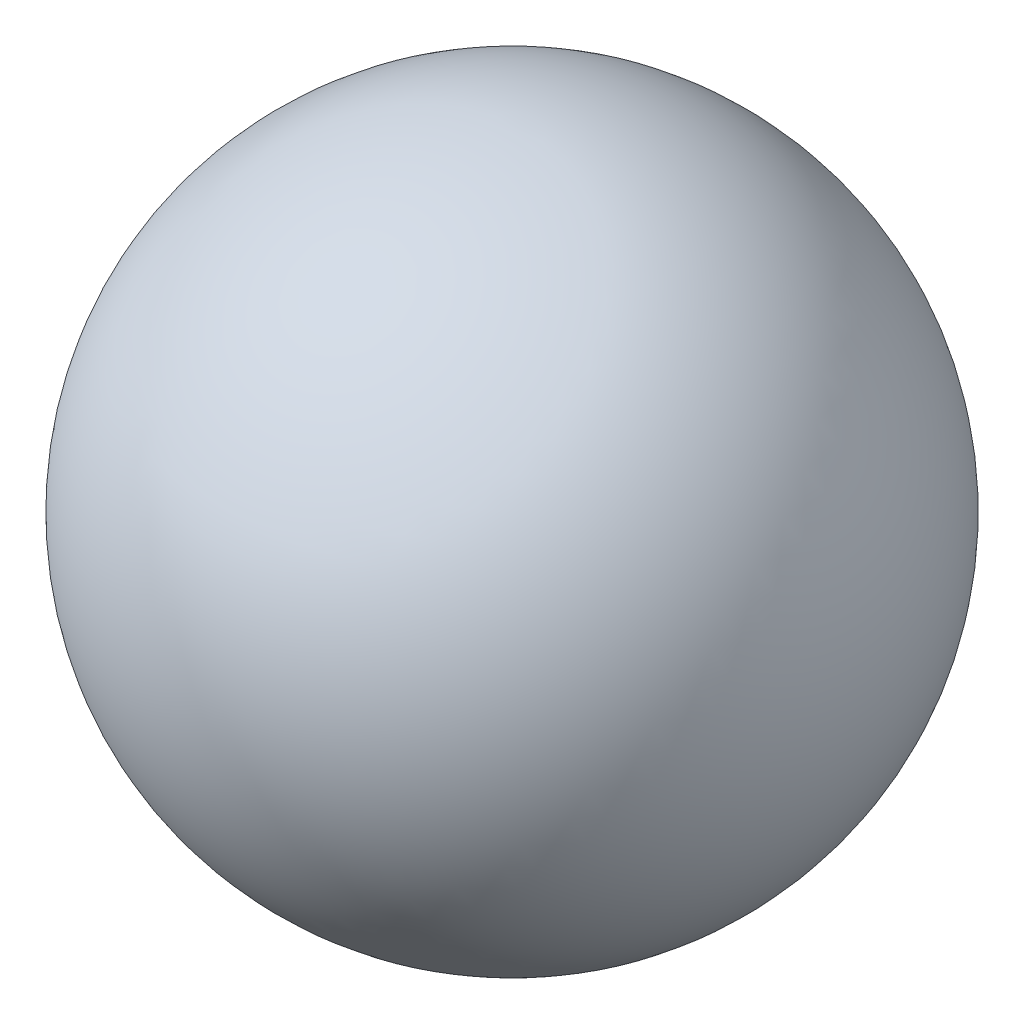
ISO-10303-21;
HEADER;
FILE_DESCRIPTION(('STEP AP214'),'2;1');
FILE_NAME('part.step','',(''),(''),'','','');
FILE_SCHEMA(('AUTOMOTIVE_DESIGN { 1 0 10303 214 1 1 1 1 }'));
ENDSEC;
DATA;
#1=APPLICATION_CONTEXT('core data for automotive mechanical design processes');
#2=APPLICATION_PROTOCOL_DEFINITION('international standard','automotive_design',2000,#1);
#3=PRODUCT_CONTEXT('',#1,'mechanical');
#4=PRODUCT('Part','Part','',(#3));
#5=PRODUCT_RELATED_PRODUCT_CATEGORY('part','',(#4));
#6=PRODUCT_DEFINITION_FORMATION('','',#4);
#7=PRODUCT_DEFINITION_CONTEXT('part definition',#1,'design');
#8=PRODUCT_DEFINITION('design','',#6,#7);
#9=PRODUCT_DEFINITION_SHAPE('','',#8);
#10=(LENGTH_UNIT() NAMED_UNIT(*) SI_UNIT(.MILLI.,.METRE.));
#11=(NAMED_UNIT(*) PLANE_ANGLE_UNIT() SI_UNIT($,.RADIAN.));
#12=(NAMED_UNIT(*) SI_UNIT($,.STERADIAN.) SOLID_ANGLE_UNIT());
#13=UNCERTAINTY_MEASURE_WITH_UNIT(LENGTH_MEASURE(1.E-05),#10,'distance_accuracy_value','');
#14=(GEOMETRIC_REPRESENTATION_CONTEXT(3) GLOBAL_UNCERTAINTY_ASSIGNED_CONTEXT((#13)) GLOBAL_UNIT_ASSIGNED_CONTEXT((#10,
#11,#12)) REPRESENTATION_CONTEXT('',''));
#15=CARTESIAN_POINT('',(0.,0.,0.));
#16=DIRECTION('',(0.,0.,1.));
#17=DIRECTION('',(1.,0.,0.));
#18=AXIS2_PLACEMENT_3D('',#15,#16,#17);
#19=CARTESIAN_POINT('',(0.,0.,0.));
#20=DIRECTION('',(0.,1.,0.));
#21=DIRECTION('',(-1.,0.,0.));
#22=AXIS2_PLACEMENT_3D('',#19,#20,#21);
#23=SPHERICAL_SURFACE('',#22,50.8);
#24=CARTESIAN_POINT('',(0.,50.8,0.));
#25=VERTEX_POINT('',#24);
#26=VERTEX_LOOP('',#25);
#27=FACE_BOUND('',#26,.T.);
#28=ADVANCED_FACE('F30',(#27),#23,.T.);
#29=CLOSED_SHELL('',(#28));
#30=MANIFOLD_SOLID_BREP('B2',#29);
#31=ADVANCED_BREP_SHAPE_REPRESENTATION('',(#18,#30),#14);
#32=SHAPE_DEFINITION_REPRESENTATION(#9,#31);
ENDSEC;
END-ISO-10303-21;
